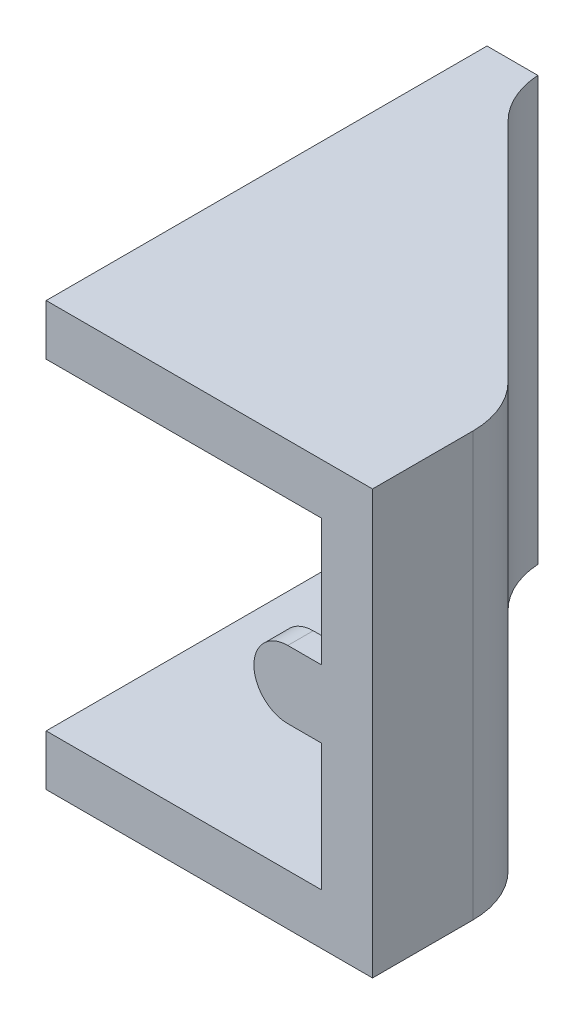
ISO-10303-21;
HEADER;
FILE_DESCRIPTION(('STEP AP214'),'2;1');
FILE_NAME('part.step','',(''),(''),'','','');
FILE_SCHEMA(('AUTOMOTIVE_DESIGN { 1 0 10303 214 1 1 1 1 }'));
ENDSEC;
DATA;
#1=APPLICATION_CONTEXT('core data for automotive mechanical design processes');
#2=APPLICATION_PROTOCOL_DEFINITION('international standard','automotive_design',2000,#1);
#3=PRODUCT_CONTEXT('',#1,'mechanical');
#4=PRODUCT('Part','Part','',(#3));
#5=PRODUCT_RELATED_PRODUCT_CATEGORY('part','',(#4));
#6=PRODUCT_DEFINITION_FORMATION('','',#4);
#7=PRODUCT_DEFINITION_CONTEXT('part definition',#1,'design');
#8=PRODUCT_DEFINITION('design','',#6,#7);
#9=PRODUCT_DEFINITION_SHAPE('','',#8);
#10=(LENGTH_UNIT() NAMED_UNIT(*) SI_UNIT(.MILLI.,.METRE.));
#11=(NAMED_UNIT(*) PLANE_ANGLE_UNIT() SI_UNIT($,.RADIAN.));
#12=(NAMED_UNIT(*) SI_UNIT($,.STERADIAN.) SOLID_ANGLE_UNIT());
#13=UNCERTAINTY_MEASURE_WITH_UNIT(LENGTH_MEASURE(1.E-05),#10,'distance_accuracy_value','');
#14=(GEOMETRIC_REPRESENTATION_CONTEXT(3) GLOBAL_UNCERTAINTY_ASSIGNED_CONTEXT((#13)) GLOBAL_UNIT_ASSIGNED_CONTEXT((#10,
#11,#12)) REPRESENTATION_CONTEXT('',''));
#15=CARTESIAN_POINT('',(0.,0.,0.));
#16=DIRECTION('',(0.,0.,1.));
#17=DIRECTION('',(1.,0.,0.));
#18=AXIS2_PLACEMENT_3D('',#15,#16,#17);
#19=CARTESIAN_POINT('',(23.2634559672906,5.,29.0208152801713));
#20=DIRECTION('',(-1.,0.,0.));
#21=DIRECTION('',(0.,0.,1.));
#22=AXIS2_PLACEMENT_3D('',#19,#20,#21);
#23=PLANE('',#22);
#24=DIRECTION('',(0.,-1.,0.));
#25=VECTOR('',#24,1.);
#26=CARTESIAN_POINT('',(23.2634559672906,-9.5,27.5208152801713));
#27=LINE('',#26,#25);
#28=CARTESIAN_POINT('',(23.2634559672906,-5.5,27.5208152801713));
#29=VERTEX_POINT('',#28);
#30=CARTESIAN_POINT('',(23.2634559672906,-9.5,27.5208152801713));
#31=VERTEX_POINT('',#30);
#32=EDGE_CURVE('E169',#29,#31,#27,.T.);
#33=ORIENTED_EDGE('',*,*,#32,.F.);
#34=DIRECTION('',(0.,0.,-1.));
#35=VECTOR('',#34,1.);
#36=CARTESIAN_POINT('',(23.2634559672906,-5.5,29.0208152801713));
#37=LINE('',#36,#35);
#38=CARTESIAN_POINT('',(23.2634559672906,-5.5,29.0208152801713));
#39=VERTEX_POINT('',#38);
#40=EDGE_CURVE('E154',#39,#29,#37,.T.);
#41=ORIENTED_EDGE('',*,*,#40,.F.);
#42=DIRECTION('',(0.,-1.,0.));
#43=VECTOR('',#42,1.);
#44=CARTESIAN_POINT('',(23.2634559672906,5.,29.0208152801713));
#45=LINE('',#44,#43);
#46=CARTESIAN_POINT('',(23.2634559672906,2.,29.0208152801713));
#47=VERTEX_POINT('',#46);
#48=EDGE_CURVE('E166',#47,#39,#45,.T.);
#49=ORIENTED_EDGE('',*,*,#48,.F.);
#50=DIRECTION('',(0.,0.,-1.));
#51=VECTOR('',#50,1.);
#52=CARTESIAN_POINT('',(23.2634559672906,2.,22.2634559672906));
#53=LINE('',#52,#51);
#54=CARTESIAN_POINT('',(23.2634559672906,2.,22.2634559672906));
#55=VERTEX_POINT('',#54);
#56=EDGE_CURVE('E250',#47,#55,#53,.T.);
#57=ORIENTED_EDGE('',*,*,#56,.T.);
#58=DIRECTION('',(0.,-1.,0.));
#59=VECTOR('',#58,1.);
#60=CARTESIAN_POINT('',(23.2634559672906,5.,22.2634559672906));
#61=LINE('',#60,#59);
#62=CARTESIAN_POINT('',(23.2634559672906,-17.,22.2634559672906));
#63=VERTEX_POINT('',#62);
#64=EDGE_CURVE('E175',#55,#63,#61,.T.);
#65=ORIENTED_EDGE('',*,*,#64,.T.);
#66=DIRECTION('',(0.,0.,1.));
#67=VECTOR('',#66,1.);
#68=CARTESIAN_POINT('',(23.2634559672906,-17.,22.2634559672906));
#69=LINE('',#68,#67);
#70=CARTESIAN_POINT('',(23.2634559672906,-17.,29.0208152801713));
#71=VERTEX_POINT('',#70);
#72=EDGE_CURVE('E270',#63,#71,#69,.T.);
#73=ORIENTED_EDGE('',*,*,#72,.T.);
#74=CARTESIAN_POINT('',(23.2634559672906,-9.5,29.0208152801713));
#75=VERTEX_POINT('',#74);
#76=EDGE_CURVE('E176',#75,#71,#45,.T.);
#77=ORIENTED_EDGE('',*,*,#76,.F.);
#78=DIRECTION('',(0.,0.,1.));
#79=VECTOR('',#78,1.);
#80=CARTESIAN_POINT('',(23.2634559672906,-9.5,29.0208152801713));
#81=LINE('',#80,#79);
#82=EDGE_CURVE('E243',#31,#75,#81,.T.);
#83=ORIENTED_EDGE('',*,*,#82,.F.);
#84=EDGE_LOOP('',(#33,#41,#49,#57,#65,#73,#77,#83));
#85=FACE_BOUND('',#84,.T.);
#86=ADVANCED_FACE('F35',(#85),#23,.T.);
#87=CARTESIAN_POINT('',(0.,0.,9.));
#88=DIRECTION('',(0.,0.,1.));
#89=DIRECTION('',(1.,0.,0.));
#90=AXIS2_PLACEMENT_3D('',#87,#88,#89);
#91=PLANE('',#90);
#92=DIRECTION('',(-1.,0.,0.));
#93=VECTOR('',#92,1.);
#94=CARTESIAN_POINT('',(7.,2.,9.));
#95=LINE('',#94,#93);
#96=CARTESIAN_POINT('',(10.,2.,9.));
#97=VERTEX_POINT('',#96);
#98=CARTESIAN_POINT('',(7.,2.,9.));
#99=VERTEX_POINT('',#98);
#100=EDGE_CURVE('E255',#97,#99,#95,.T.);
#101=ORIENTED_EDGE('',*,*,#100,.T.);
#102=DIRECTION('',(0.,-1.,0.));
#103=VECTOR('',#102,1.);
#104=CARTESIAN_POINT('',(7.,5.,9.));
#105=LINE('',#104,#103);
#106=CARTESIAN_POINT('',(7.00000000000001,-17.,9.));
#107=VERTEX_POINT('',#106);
#108=EDGE_CURVE('E186',#99,#107,#105,.T.);
#109=ORIENTED_EDGE('',*,*,#108,.T.);
#110=DIRECTION('',(1.,0.,0.));
#111=VECTOR('',#110,1.);
#112=CARTESIAN_POINT('',(7.00000000000001,-17.,9.));
#113=LINE('',#112,#111);
#114=CARTESIAN_POINT('',(10.,-17.,9.));
#115=VERTEX_POINT('',#114);
#116=EDGE_CURVE('E264',#107,#115,#113,.T.);
#117=ORIENTED_EDGE('',*,*,#116,.T.);
#118=DIRECTION('',(0.,1.,0.));
#119=VECTOR('',#118,1.);
#120=CARTESIAN_POINT('',(10.,5.,9.));
#121=LINE('',#120,#119);
#122=EDGE_CURVE('E188',#115,#97,#121,.T.);
#123=ORIENTED_EDGE('',*,*,#122,.T.);
#124=EDGE_LOOP('',(#101,#109,#117,#123));
#125=FACE_BOUND('',#124,.T.);
#126=ADVANCED_FACE('F306',(#125),#91,.T.);
#127=CARTESIAN_POINT('',(10.,5.,9.));
#128=DIRECTION('',(-0.707106781186547,0.,0.707106781186548));
#129=DIRECTION('',(0.707106781186548,0.,0.707106781186547));
#130=AXIS2_PLACEMENT_3D('',#127,#128,#129);
#131=PLANE('',#130);
#132=DIRECTION('',(-0.707106781186548,0.,-0.707106781186547));
#133=VECTOR('',#132,1.);
#134=CARTESIAN_POINT('',(10.,2.,9.));
#135=LINE('',#134,#133);
#136=EDGE_CURVE('E252',#55,#97,#135,.T.);
#137=ORIENTED_EDGE('',*,*,#136,.T.);
#138=ORIENTED_EDGE('',*,*,#122,.F.);
#139=DIRECTION('',(0.707106781186548,0.,0.707106781186547));
#140=VECTOR('',#139,1.);
#141=CARTESIAN_POINT('',(10.,-17.,9.));
#142=LINE('',#141,#140);
#143=EDGE_CURVE('E267',#115,#63,#142,.T.);
#144=ORIENTED_EDGE('',*,*,#143,.T.);
#145=ORIENTED_EDGE('',*,*,#64,.F.);
#146=EDGE_LOOP('',(#137,#138,#144,#145));
#147=FACE_BOUND('',#146,.T.);
#148=ADVANCED_FACE('F308',(#147),#131,.T.);
#149=CARTESIAN_POINT('',(0.,0.,3.));
#150=DIRECTION('',(0.,0.,1.));
#151=DIRECTION('',(1.,0.,0.));
#152=AXIS2_PLACEMENT_3D('',#149,#150,#151);
#153=PLANE('',#152);
#154=DIRECTION('',(1.,0.,0.));
#155=VECTOR('',#154,1.);
#156=CARTESIAN_POINT('',(7.00000000000001,-20.,3.));
#157=LINE('',#156,#155);
#158=CARTESIAN_POINT('',(7.00000000000001,-20.,3.));
#159=VERTEX_POINT('',#158);
#160=CARTESIAN_POINT('',(10.,-20.,3.));
#161=VERTEX_POINT('',#160);
#162=EDGE_CURVE('E178',#159,#161,#157,.T.);
#163=ORIENTED_EDGE('',*,*,#162,.F.);
#164=DIRECTION('',(0.,-1.,0.));
#165=VECTOR('',#164,1.);
#166=CARTESIAN_POINT('',(7.,5.,3.));
#167=LINE('',#166,#165);
#168=CARTESIAN_POINT('',(7.,5.,3.));
#169=VERTEX_POINT('',#168);
#170=EDGE_CURVE('E193',#169,#159,#167,.T.);
#171=ORIENTED_EDGE('',*,*,#170,.F.);
#172=DIRECTION('',(-1.,0.,0.));
#173=VECTOR('',#172,1.);
#174=CARTESIAN_POINT('',(7.,5.,3.));
#175=LINE('',#174,#173);
#176=CARTESIAN_POINT('',(10.,5.,3.));
#177=VERTEX_POINT('',#176);
#178=EDGE_CURVE('E189',#177,#169,#175,.T.);
#179=ORIENTED_EDGE('',*,*,#178,.F.);
#180=DIRECTION('',(0.,1.,0.));
#181=VECTOR('',#180,1.);
#182=CARTESIAN_POINT('',(10.,5.,3.));
#183=LINE('',#182,#181);
#184=EDGE_CURVE('E199',#161,#177,#183,.T.);
#185=ORIENTED_EDGE('',*,*,#184,.F.);
#186=EDGE_LOOP('',(#163,#171,#179,#185));
#187=FACE_BOUND('',#186,.T.);
#188=ADVANCED_FACE('F346',(#187),#153,.F.);
#189=CARTESIAN_POINT('',(7.,5.,9.));
#190=DIRECTION('',(1.,0.,0.));
#191=DIRECTION('',(0.,1.,0.));
#192=AXIS2_PLACEMENT_3D('',#189,#190,#191);
#193=PLANE('',#192);
#194=DIRECTION('',(0.,0.,-1.));
#195=VECTOR('',#194,1.);
#196=CARTESIAN_POINT('',(7.,5.,9.));
#197=LINE('',#196,#195);
#198=CARTESIAN_POINT('',(7.,5.,29.0208152801713));
#199=VERTEX_POINT('',#198);
#200=EDGE_CURVE('E192',#199,#169,#197,.T.);
#201=ORIENTED_EDGE('',*,*,#200,.T.);
#202=ORIENTED_EDGE('',*,*,#170,.T.);
#203=DIRECTION('',(0.,0.,-1.));
#204=VECTOR('',#203,1.);
#205=CARTESIAN_POINT('',(7.00000000000001,-20.,9.));
#206=LINE('',#205,#204);
#207=CARTESIAN_POINT('',(7.00000000000001,-20.,29.0208152801713));
#208=VERTEX_POINT('',#207);
#209=EDGE_CURVE('E196',#208,#159,#206,.T.);
#210=ORIENTED_EDGE('',*,*,#209,.F.);
#211=DIRECTION('',(0.,-1.,0.));
#212=VECTOR('',#211,1.);
#213=CARTESIAN_POINT('',(7.00000000000001,-17.,29.0208152801713));
#214=LINE('',#213,#212);
#215=CARTESIAN_POINT('',(7.00000000000001,-17.,29.0208152801713));
#216=VERTEX_POINT('',#215);
#217=EDGE_CURVE('E276',#216,#208,#214,.T.);
#218=ORIENTED_EDGE('',*,*,#217,.F.);
#219=DIRECTION('',(0.,0.,-1.));
#220=VECTOR('',#219,1.);
#221=CARTESIAN_POINT('',(7.00000000000001,-17.,29.0208152801713));
#222=LINE('',#221,#220);
#223=EDGE_CURVE('E261',#216,#107,#222,.T.);
#224=ORIENTED_EDGE('',*,*,#223,.T.);
#225=ORIENTED_EDGE('',*,*,#108,.F.);
#226=DIRECTION('',(0.,0.,1.));
#227=VECTOR('',#226,1.);
#228=CARTESIAN_POINT('',(7.,2.,29.0208152801713));
#229=LINE('',#228,#227);
#230=CARTESIAN_POINT('',(7.,2.,29.0208152801713));
#231=VERTEX_POINT('',#230);
#232=EDGE_CURVE('E160',#99,#231,#229,.T.);
#233=ORIENTED_EDGE('',*,*,#232,.T.);
#234=DIRECTION('',(0.,1.,0.));
#235=VECTOR('',#234,1.);
#236=CARTESIAN_POINT('',(7.,2.,29.0208152801713));
#237=LINE('',#236,#235);
#238=EDGE_CURVE('E258',#231,#199,#237,.T.);
#239=ORIENTED_EDGE('',*,*,#238,.T.);
#240=EDGE_LOOP('',(#201,#202,#210,#218,#224,#225,#233,#239));
#241=FACE_BOUND('',#240,.T.);
#242=ADVANCED_FACE('F298',(#241),#193,.F.);
#243=CARTESIAN_POINT('',(7.00000000000001,-20.,9.));
#244=DIRECTION('',(0.,1.,0.));
#245=DIRECTION('',(0.,0.,1.));
#246=AXIS2_PLACEMENT_3D('',#243,#244,#245);
#247=PLANE('',#246);
#248=ORIENTED_EDGE('',*,*,#162,.T.);
#249=CARTESIAN_POINT('',(14.9894762713713,-20.,2.67576777238648));
#250=DIRECTION('',(0.,1.,0.));
#251=DIRECTION('',(0.,0.,1.));
#252=AXIS2_PLACEMENT_3D('',#249,#250,#251);
#253=CIRCLE('',#252,5.);
#254=CARTESIAN_POINT('',(11.4539423654385,-20.,6.21130167831922));
#255=VERTEX_POINT('',#254);
#256=EDGE_CURVE('E219',#161,#255,#253,.T.);
#257=ORIENTED_EDGE('',*,*,#256,.T.);
#258=DIRECTION('',(0.707106781186548,0.,0.707106781186548));
#259=VECTOR('',#258,1.);
#260=CARTESIAN_POINT('',(26.2634559672906,-20.,21.0208152801713));
#261=LINE('',#260,#259);
#262=CARTESIAN_POINT('',(24.7989898732233,-20.,19.556349186104));
#263=VERTEX_POINT('',#262);
#264=EDGE_CURVE('E279',#255,#263,#261,.T.);
#265=ORIENTED_EDGE('',*,*,#264,.T.);
#266=CARTESIAN_POINT('',(21.2634559672906,-20.,23.0918830920368));
#267=DIRECTION('',(0.,1.,0.));
#268=DIRECTION('',(0.,0.,1.));
#269=AXIS2_PLACEMENT_3D('',#266,#267,#268);
#270=CIRCLE('',#269,5.);
#271=CARTESIAN_POINT('',(26.2634559672906,-20.,23.0918830920368));
#272=VERTEX_POINT('',#271);
#273=EDGE_CURVE('E210',#263,#272,#270,.F.);
#274=ORIENTED_EDGE('',*,*,#273,.T.);
#275=DIRECTION('',(0.,0.,1.));
#276=VECTOR('',#275,1.);
#277=CARTESIAN_POINT('',(26.2634559672906,-20.,21.0208152801713));
#278=LINE('',#277,#276);
#279=CARTESIAN_POINT('',(26.2634559672906,-20.,29.0208152801713));
#280=VERTEX_POINT('',#279);
#281=EDGE_CURVE('E288',#272,#280,#278,.T.);
#282=ORIENTED_EDGE('',*,*,#281,.T.);
#283=DIRECTION('',(-1.,0.,0.));
#284=VECTOR('',#283,1.);
#285=CARTESIAN_POINT('',(26.2634559672906,-20.,29.0208152801713));
#286=LINE('',#285,#284);
#287=EDGE_CURVE('E283',#280,#208,#286,.T.);
#288=ORIENTED_EDGE('',*,*,#287,.T.);
#289=ORIENTED_EDGE('',*,*,#209,.T.);
#290=EDGE_LOOP('',(#248,#257,#265,#274,#282,#288,#289));
#291=FACE_BOUND('',#290,.T.);
#292=ADVANCED_FACE('F292',(#291),#247,.F.);
#293=CARTESIAN_POINT('',(7.,5.,9.));
#294=DIRECTION('',(0.,-1.,0.));
#295=DIRECTION('',(0.,0.,-1.));
#296=AXIS2_PLACEMENT_3D('',#293,#294,#295);
#297=PLANE('',#296);
#298=DIRECTION('',(0.,0.,1.));
#299=VECTOR('',#298,1.);
#300=CARTESIAN_POINT('',(26.2634559672906,5.,21.0208152801713));
#301=LINE('',#300,#299);
#302=CARTESIAN_POINT('',(26.2634559672906,5.,23.0918830920368));
#303=VERTEX_POINT('',#302);
#304=CARTESIAN_POINT('',(26.2634559672906,5.,29.0208152801713));
#305=VERTEX_POINT('',#304);
#306=EDGE_CURVE('E282',#303,#305,#301,.T.);
#307=ORIENTED_EDGE('',*,*,#306,.F.);
#308=CARTESIAN_POINT('',(21.2634559672906,5.,23.0918830920368));
#309=DIRECTION('',(0.,-1.,0.));
#310=DIRECTION('',(0.,0.,-1.));
#311=AXIS2_PLACEMENT_3D('',#308,#309,#310);
#312=CIRCLE('',#311,5.);
#313=CARTESIAN_POINT('',(24.7989898732233,5.,19.556349186104));
#314=VERTEX_POINT('',#313);
#315=EDGE_CURVE('E214',#303,#314,#312,.F.);
#316=ORIENTED_EDGE('',*,*,#315,.T.);
#317=DIRECTION('',(0.707106781186548,0.,0.707106781186548));
#318=VECTOR('',#317,1.);
#319=CARTESIAN_POINT('',(26.2634559672906,5.,21.0208152801713));
#320=LINE('',#319,#318);
#321=CARTESIAN_POINT('',(11.4539423654385,5.,6.21130167831921));
#322=VERTEX_POINT('',#321);
#323=EDGE_CURVE('E280',#322,#314,#320,.T.);
#324=ORIENTED_EDGE('',*,*,#323,.F.);
#325=CARTESIAN_POINT('',(14.9894762713713,5.,2.67576777238648));
#326=DIRECTION('',(0.,-1.,0.));
#327=DIRECTION('',(0.,0.,-1.));
#328=AXIS2_PLACEMENT_3D('',#325,#326,#327);
#329=CIRCLE('',#328,5.);
#330=EDGE_CURVE('E221',#322,#177,#329,.T.);
#331=ORIENTED_EDGE('',*,*,#330,.T.);
#332=ORIENTED_EDGE('',*,*,#178,.T.);
#333=ORIENTED_EDGE('',*,*,#200,.F.);
#334=DIRECTION('',(-1.,0.,0.));
#335=VECTOR('',#334,1.);
#336=CARTESIAN_POINT('',(26.2634559672906,5.,29.0208152801713));
#337=LINE('',#336,#335);
#338=EDGE_CURVE('E185',#305,#199,#337,.T.);
#339=ORIENTED_EDGE('',*,*,#338,.F.);
#340=EDGE_LOOP('',(#307,#316,#324,#331,#332,#333,#339));
#341=FACE_BOUND('',#340,.T.);
#342=ADVANCED_FACE('F338',(#341),#297,.F.);
#343=CARTESIAN_POINT('',(26.2634559672906,5.,29.0208152801713));
#344=DIRECTION('',(0.,0.,1.));
#345=DIRECTION('',(1.,0.,0.));
#346=AXIS2_PLACEMENT_3D('',#343,#344,#345);
#347=PLANE('',#346);
#348=CARTESIAN_POINT('',(21.2634559672906,-7.5,29.0208152801713));
#349=DIRECTION('',(0.,0.,1.));
#350=DIRECTION('',(1.,0.,0.));
#351=AXIS2_PLACEMENT_3D('',#348,#349,#350);
#352=CIRCLE('',#351,2.);
#353=CARTESIAN_POINT('',(21.2634559672906,-5.5,29.0208152801713));
#354=VERTEX_POINT('',#353);
#355=CARTESIAN_POINT('',(19.2634559672906,-7.5,29.0208152801713));
#356=VERTEX_POINT('',#355);
#357=EDGE_CURVE('E223',#354,#356,#352,.T.);
#358=ORIENTED_EDGE('',*,*,#357,.T.);
#359=CARTESIAN_POINT('',(21.2634559672906,-7.5,29.0208152801713));
#360=DIRECTION('',(0.,0.,1.));
#361=DIRECTION('',(1.,0.,0.));
#362=AXIS2_PLACEMENT_3D('',#359,#360,#361);
#363=CIRCLE('',#362,2.);
#364=CARTESIAN_POINT('',(21.2634559672906,-9.5,29.0208152801713));
#365=VERTEX_POINT('',#364);
#366=EDGE_CURVE('E225',#356,#365,#363,.T.);
#367=ORIENTED_EDGE('',*,*,#366,.T.);
#368=DIRECTION('',(1.,0.,0.));
#369=VECTOR('',#368,1.);
#370=CARTESIAN_POINT('',(19.2634559672906,-9.5,29.0208152801713));
#371=LINE('',#370,#369);
#372=EDGE_CURVE('E237',#365,#75,#371,.T.);
#373=ORIENTED_EDGE('',*,*,#372,.T.);
#374=ORIENTED_EDGE('',*,*,#76,.T.);
#375=DIRECTION('',(-1.,0.,0.));
#376=VECTOR('',#375,1.);
#377=CARTESIAN_POINT('',(23.2634559672906,-17.,29.0208152801713));
#378=LINE('',#377,#376);
#379=EDGE_CURVE('E273',#71,#216,#378,.T.);
#380=ORIENTED_EDGE('',*,*,#379,.T.);
#381=ORIENTED_EDGE('',*,*,#217,.T.);
#382=ORIENTED_EDGE('',*,*,#287,.F.);
#383=DIRECTION('',(0.,-1.,0.));
#384=VECTOR('',#383,1.);
#385=CARTESIAN_POINT('',(26.2634559672906,5.,29.0208152801713));
#386=LINE('',#385,#384);
#387=EDGE_CURVE('E180',#305,#280,#386,.T.);
#388=ORIENTED_EDGE('',*,*,#387,.F.);
#389=ORIENTED_EDGE('',*,*,#338,.T.);
#390=ORIENTED_EDGE('',*,*,#238,.F.);
#391=DIRECTION('',(1.,0.,0.));
#392=VECTOR('',#391,1.);
#393=CARTESIAN_POINT('',(23.2634559672906,2.,29.0208152801713));
#394=LINE('',#393,#392);
#395=EDGE_CURVE('E173',#231,#47,#394,.T.);
#396=ORIENTED_EDGE('',*,*,#395,.T.);
#397=ORIENTED_EDGE('',*,*,#48,.T.);
#398=DIRECTION('',(1.,0.,0.));
#399=VECTOR('',#398,1.);
#400=CARTESIAN_POINT('',(19.2634559672906,-5.5,29.0208152801713));
#401=LINE('',#400,#399);
#402=EDGE_CURVE('E151',#354,#39,#401,.T.);
#403=ORIENTED_EDGE('',*,*,#402,.F.);
#404=EDGE_LOOP('',(#358,#367,#373,#374,#380,#381,#382,#388,#389,#390,#396,#397,#403));
#405=FACE_BOUND('',#404,.T.);
#406=ADVANCED_FACE('F171',(#405),#347,.T.);
#407=CARTESIAN_POINT('',(26.2634559672906,5.,21.0208152801713));
#408=DIRECTION('',(1.,0.,0.));
#409=DIRECTION('',(0.,0.,-1.));
#410=AXIS2_PLACEMENT_3D('',#407,#408,#409);
#411=PLANE('',#410);
#412=ORIENTED_EDGE('',*,*,#281,.F.);
#413=DIRECTION('',(0.,-1.,0.));
#414=VECTOR('',#413,1.);
#415=CARTESIAN_POINT('',(26.2634559672906,5.,23.0918830920368));
#416=LINE('',#415,#414);
#417=EDGE_CURVE('E212',#272,#303,#416,.F.);
#418=ORIENTED_EDGE('',*,*,#417,.T.);
#419=ORIENTED_EDGE('',*,*,#306,.T.);
#420=ORIENTED_EDGE('',*,*,#387,.T.);
#421=EDGE_LOOP('',(#412,#418,#419,#420));
#422=FACE_BOUND('',#421,.T.);
#423=ADVANCED_FACE('F337',(#422),#411,.T.);
#424=CARTESIAN_POINT('',(26.2634559672906,5.,21.0208152801713));
#425=DIRECTION('',(0.707106781186548,0.,-0.707106781186548));
#426=DIRECTION('',(-0.707106781186548,0.,-0.707106781186548));
#427=AXIS2_PLACEMENT_3D('',#424,#425,#426);
#428=PLANE('',#427);
#429=ORIENTED_EDGE('',*,*,#264,.F.);
#430=DIRECTION('',(0.,-1.,0.));
#431=VECTOR('',#430,1.);
#432=CARTESIAN_POINT('',(11.4539423654385,5.,6.21130167831922));
#433=LINE('',#432,#431);
#434=EDGE_CURVE('E217',#255,#322,#433,.F.);
#435=ORIENTED_EDGE('',*,*,#434,.T.);
#436=ORIENTED_EDGE('',*,*,#323,.T.);
#437=DIRECTION('',(0.,-1.,0.));
#438=VECTOR('',#437,1.);
#439=CARTESIAN_POINT('',(24.7989898732233,5.,19.556349186104));
#440=LINE('',#439,#438);
#441=EDGE_CURVE('E195',#314,#263,#440,.T.);
#442=ORIENTED_EDGE('',*,*,#441,.T.);
#443=EDGE_LOOP('',(#429,#435,#436,#442));
#444=FACE_BOUND('',#443,.T.);
#445=ADVANCED_FACE('F341',(#444),#428,.T.);
#446=CARTESIAN_POINT('',(0.,-17.,0.));
#447=DIRECTION('',(0.,-1.,0.));
#448=DIRECTION('',(0.,0.,-1.));
#449=AXIS2_PLACEMENT_3D('',#446,#447,#448);
#450=PLANE('',#449);
#451=ORIENTED_EDGE('',*,*,#223,.F.);
#452=ORIENTED_EDGE('',*,*,#379,.F.);
#453=ORIENTED_EDGE('',*,*,#72,.F.);
#454=ORIENTED_EDGE('',*,*,#143,.F.);
#455=ORIENTED_EDGE('',*,*,#116,.F.);
#456=EDGE_LOOP('',(#451,#452,#453,#454,#455));
#457=FACE_BOUND('',#456,.T.);
#458=ADVANCED_FACE('F302',(#457),#450,.F.);
#459=CARTESIAN_POINT('',(0.,2.,0.));
#460=DIRECTION('',(0.,-1.,0.));
#461=DIRECTION('',(0.,0.,-1.));
#462=AXIS2_PLACEMENT_3D('',#459,#460,#461);
#463=PLANE('',#462);
#464=ORIENTED_EDGE('',*,*,#232,.F.);
#465=ORIENTED_EDGE('',*,*,#100,.F.);
#466=ORIENTED_EDGE('',*,*,#136,.F.);
#467=ORIENTED_EDGE('',*,*,#56,.F.);
#468=ORIENTED_EDGE('',*,*,#395,.F.);
#469=EDGE_LOOP('',(#464,#465,#466,#467,#468));
#470=FACE_BOUND('',#469,.T.);
#471=ADVANCED_FACE('F311',(#470),#463,.T.);
#472=CARTESIAN_POINT('',(21.2634559672906,5.,23.0918830920368));
#473=DIRECTION('',(0.,-1.,0.));
#474=DIRECTION('',(0.,0.,-1.));
#475=AXIS2_PLACEMENT_3D('',#472,#473,#474);
#476=CYLINDRICAL_SURFACE('',#475,5.);
#477=ORIENTED_EDGE('',*,*,#315,.F.);
#478=ORIENTED_EDGE('',*,*,#417,.F.);
#479=ORIENTED_EDGE('',*,*,#273,.F.);
#480=ORIENTED_EDGE('',*,*,#441,.F.);
#481=EDGE_LOOP('',(#477,#478,#479,#480));
#482=FACE_BOUND('',#481,.T.);
#483=ADVANCED_FACE('F357',(#482),#476,.T.);
#484=CARTESIAN_POINT('',(14.9894762713713,0.,2.67576777238648));
#485=DIRECTION('',(0.,1.,0.));
#486=DIRECTION('',(-1.,0.,0.));
#487=AXIS2_PLACEMENT_3D('',#484,#485,#486);
#488=CYLINDRICAL_SURFACE('',#487,5.);
#489=ORIENTED_EDGE('',*,*,#330,.F.);
#490=ORIENTED_EDGE('',*,*,#434,.F.);
#491=ORIENTED_EDGE('',*,*,#256,.F.);
#492=ORIENTED_EDGE('',*,*,#184,.T.);
#493=EDGE_LOOP('',(#489,#490,#491,#492));
#494=FACE_BOUND('',#493,.T.);
#495=ADVANCED_FACE('F360',(#494),#488,.F.);
#496=CARTESIAN_POINT('',(19.2634559672906,-5.5,29.0208152801713));
#497=DIRECTION('',(0.,-1.,0.));
#498=DIRECTION('',(0.,0.,-1.));
#499=AXIS2_PLACEMENT_3D('',#496,#497,#498);
#500=PLANE('',#499);
#501=DIRECTION('',(1.,0.,0.));
#502=VECTOR('',#501,1.);
#503=CARTESIAN_POINT('',(19.2634559672906,-5.5,27.5208152801713));
#504=LINE('',#503,#502);
#505=CARTESIAN_POINT('',(21.2634559672906,-5.5,27.5208152801713));
#506=VERTEX_POINT('',#505);
#507=EDGE_CURVE('E161',#506,#29,#504,.T.);
#508=ORIENTED_EDGE('',*,*,#507,.F.);
#509=DIRECTION('',(0.,0.,-1.));
#510=VECTOR('',#509,1.);
#511=CARTESIAN_POINT('',(21.2634559672906,-5.5,29.0208152801713));
#512=LINE('',#511,#510);
#513=EDGE_CURVE('E11',#506,#354,#512,.F.);
#514=ORIENTED_EDGE('',*,*,#513,.T.);
#515=ORIENTED_EDGE('',*,*,#402,.T.);
#516=ORIENTED_EDGE('',*,*,#40,.T.);
#517=EDGE_LOOP('',(#508,#514,#515,#516));
#518=FACE_BOUND('',#517,.T.);
#519=ADVANCED_FACE('F153',(#518),#500,.F.);
#520=CARTESIAN_POINT('',(19.2634559672906,-9.5,27.5208152801713));
#521=DIRECTION('',(0.,0.,1.));
#522=DIRECTION('',(1.,0.,0.));
#523=AXIS2_PLACEMENT_3D('',#520,#521,#522);
#524=PLANE('',#523);
#525=DIRECTION('',(1.,0.,0.));
#526=VECTOR('',#525,1.);
#527=CARTESIAN_POINT('',(19.2634559672906,-9.5,27.5208152801713));
#528=LINE('',#527,#526);
#529=CARTESIAN_POINT('',(21.2634559672906,-9.5,27.5208152801713));
#530=VERTEX_POINT('',#529);
#531=EDGE_CURVE('E236',#530,#31,#528,.T.);
#532=ORIENTED_EDGE('',*,*,#531,.F.);
#533=CARTESIAN_POINT('',(21.2634559672906,-7.5,27.5208152801713));
#534=DIRECTION('',(0.,0.,1.));
#535=DIRECTION('',(1.,0.,0.));
#536=AXIS2_PLACEMENT_3D('',#533,#534,#535);
#537=CIRCLE('',#536,2.);
#538=CARTESIAN_POINT('',(19.2634559672906,-7.5,27.5208152801713));
#539=VERTEX_POINT('',#538);
#540=EDGE_CURVE('E44',#530,#539,#537,.F.);
#541=ORIENTED_EDGE('',*,*,#540,.T.);
#542=CARTESIAN_POINT('',(21.2634559672906,-7.5,27.5208152801713));
#543=DIRECTION('',(0.,0.,1.));
#544=DIRECTION('',(1.,0.,0.));
#545=AXIS2_PLACEMENT_3D('',#542,#543,#544);
#546=CIRCLE('',#545,2.);
#547=EDGE_CURVE('E51',#539,#506,#546,.F.);
#548=ORIENTED_EDGE('',*,*,#547,.T.);
#549=ORIENTED_EDGE('',*,*,#507,.T.);
#550=ORIENTED_EDGE('',*,*,#32,.T.);
#551=EDGE_LOOP('',(#532,#541,#548,#549,#550));
#552=FACE_BOUND('',#551,.T.);
#553=ADVANCED_FACE('F240',(#552),#524,.F.);
#554=CARTESIAN_POINT('',(19.2634559672906,-9.5,29.0208152801713));
#555=DIRECTION('',(0.,1.,0.));
#556=DIRECTION('',(0.,0.,1.));
#557=AXIS2_PLACEMENT_3D('',#554,#555,#556);
#558=PLANE('',#557);
#559=ORIENTED_EDGE('',*,*,#372,.F.);
#560=DIRECTION('',(0.,0.,1.));
#561=VECTOR('',#560,1.);
#562=CARTESIAN_POINT('',(21.2634559672906,-9.5,27.5208152801713));
#563=LINE('',#562,#561);
#564=EDGE_CURVE('E227',#365,#530,#563,.F.);
#565=ORIENTED_EDGE('',*,*,#564,.T.);
#566=ORIENTED_EDGE('',*,*,#531,.T.);
#567=ORIENTED_EDGE('',*,*,#82,.T.);
#568=EDGE_LOOP('',(#559,#565,#566,#567));
#569=FACE_BOUND('',#568,.T.);
#570=ADVANCED_FACE('F234',(#569),#558,.F.);
#571=CARTESIAN_POINT('',(21.2634559672907,-7.5,0.));
#572=DIRECTION('',(0.,0.,1.));
#573=DIRECTION('',(1.,0.,0.));
#574=AXIS2_PLACEMENT_3D('',#571,#572,#573);
#575=CYLINDRICAL_SURFACE('',#574,2.);
#576=ORIENTED_EDGE('',*,*,#513,.F.);
#577=ORIENTED_EDGE('',*,*,#547,.F.);
#578=DIRECTION('',(0.,0.,-1.));
#579=VECTOR('',#578,1.);
#580=CARTESIAN_POINT('',(19.2634559672906,-7.5,27.5208152801713));
#581=LINE('',#580,#579);
#582=EDGE_CURVE('E39',#356,#539,#581,.T.);
#583=ORIENTED_EDGE('',*,*,#582,.F.);
#584=ORIENTED_EDGE('',*,*,#357,.F.);
#585=EDGE_LOOP('',(#576,#577,#583,#584));
#586=FACE_BOUND('',#585,.T.);
#587=ADVANCED_FACE('F37',(#586),#575,.T.);
#588=CARTESIAN_POINT('',(21.2634559672907,-7.5,0.));
#589=DIRECTION('',(0.,0.,-1.));
#590=DIRECTION('',(-1.,0.,0.));
#591=AXIS2_PLACEMENT_3D('',#588,#589,#590);
#592=CYLINDRICAL_SURFACE('',#591,2.);
#593=ORIENTED_EDGE('',*,*,#540,.F.);
#594=ORIENTED_EDGE('',*,*,#564,.F.);
#595=ORIENTED_EDGE('',*,*,#366,.F.);
#596=ORIENTED_EDGE('',*,*,#582,.T.);
#597=EDGE_LOOP('',(#593,#594,#595,#596));
#598=FACE_BOUND('',#597,.T.);
#599=ADVANCED_FACE('F316',(#598),#592,.T.);
#600=CLOSED_SHELL('',(#86,#126,#148,#188,#242,#292,#342,#406,#423,#445,#458,#471,#483,#495,#519,
#553,#570,#587,#599));
#601=MANIFOLD_SOLID_BREP('B2',#600);
#602=ADVANCED_BREP_SHAPE_REPRESENTATION('',(#18,#601),#14);
#603=SHAPE_DEFINITION_REPRESENTATION(#9,#602);
ENDSEC;
END-ISO-10303-21;
